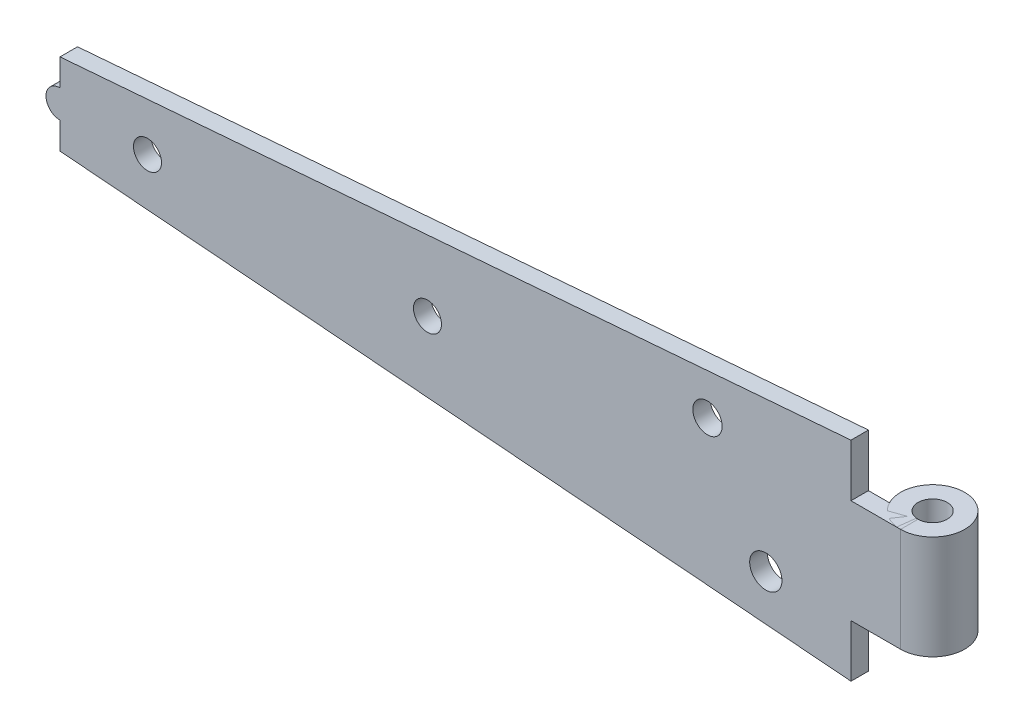
ISO-10303-21;
HEADER;
FILE_DESCRIPTION(('STEP AP214'),'2;1');
FILE_NAME('part.step','',(''),(''),'','','');
FILE_SCHEMA(('AUTOMOTIVE_DESIGN { 1 0 10303 214 1 1 1 1 }'));
ENDSEC;
DATA;
#1=APPLICATION_CONTEXT('core data for automotive mechanical design processes');
#2=APPLICATION_PROTOCOL_DEFINITION('international standard','automotive_design',2000,#1);
#3=PRODUCT_CONTEXT('',#1,'mechanical');
#4=PRODUCT('Part','Part','',(#3));
#5=PRODUCT_RELATED_PRODUCT_CATEGORY('part','',(#4));
#6=PRODUCT_DEFINITION_FORMATION('','',#4);
#7=PRODUCT_DEFINITION_CONTEXT('part definition',#1,'design');
#8=PRODUCT_DEFINITION('design','',#6,#7);
#9=PRODUCT_DEFINITION_SHAPE('','',#8);
#10=(LENGTH_UNIT() NAMED_UNIT(*) SI_UNIT(.MILLI.,.METRE.));
#11=(NAMED_UNIT(*) PLANE_ANGLE_UNIT() SI_UNIT($,.RADIAN.));
#12=(NAMED_UNIT(*) SI_UNIT($,.STERADIAN.) SOLID_ANGLE_UNIT());
#13=UNCERTAINTY_MEASURE_WITH_UNIT(LENGTH_MEASURE(1.E-05),#10,'distance_accuracy_value','');
#14=(GEOMETRIC_REPRESENTATION_CONTEXT(3) GLOBAL_UNCERTAINTY_ASSIGNED_CONTEXT((#13)) GLOBAL_UNIT_ASSIGNED_CONTEXT((#10,
#11,#12)) REPRESENTATION_CONTEXT('',''));
#15=CARTESIAN_POINT('',(0.,0.,0.));
#16=DIRECTION('',(0.,0.,1.));
#17=DIRECTION('',(1.,0.,0.));
#18=AXIS2_PLACEMENT_3D('',#15,#16,#17);
#19=CARTESIAN_POINT('',(8.49999999999998,26.8,-2.5));
#20=DIRECTION('',(0.,-1.,0.));
#21=DIRECTION('',(0.,0.,-1.));
#22=AXIS2_PLACEMENT_3D('',#19,#20,#21);
#23=CYLINDRICAL_SURFACE('',#22,5.5);
#24=CARTESIAN_POINT('',(8.49999999999998,26.8,-2.5));
#25=DIRECTION('',(0.,1.,0.));
#26=DIRECTION('',(0.,0.,1.));
#27=AXIS2_PLACEMENT_3D('',#24,#25,#26);
#28=CIRCLE('',#27,5.5);
#29=CARTESIAN_POINT('',(8.49999999999998,26.8,3.));
#30=VERTEX_POINT('',#29);
#31=EDGE_CURVE('E11',#30,#30,#28,.T.);
#32=ORIENTED_EDGE('',*,*,#31,.F.);
#33=EDGE_LOOP('',(#32));
#34=FACE_BOUND('',#33,.T.);
#35=CARTESIAN_POINT('',(8.49999999999998,9.,-2.5));
#36=DIRECTION('',(0.,1.,0.));
#37=DIRECTION('',(0.,0.,1.));
#38=AXIS2_PLACEMENT_3D('',#35,#36,#37);
#39=CIRCLE('',#38,5.5);
#40=CARTESIAN_POINT('',(8.49999999999998,9.,3.));
#41=VERTEX_POINT('',#40);
#42=EDGE_CURVE('E58',#41,#41,#39,.T.);
#43=ORIENTED_EDGE('',*,*,#42,.T.);
#44=EDGE_LOOP('',(#43));
#45=FACE_BOUND('',#44,.T.);
#46=ADVANCED_FACE('F52',(#34,#45),#23,.T.);
#47=CARTESIAN_POINT('',(8.49999999999998,26.8,-2.5));
#48=DIRECTION('',(0.,1.,0.));
#49=DIRECTION('',(0.,0.,1.));
#50=AXIS2_PLACEMENT_3D('',#47,#48,#49);
#51=PLANE('',#50);
#52=CARTESIAN_POINT('',(8.49999999999998,26.8,-2.5));
#53=DIRECTION('',(0.,1.,0.));
#54=DIRECTION('',(0.,0.,1.));
#55=AXIS2_PLACEMENT_3D('',#52,#53,#54);
#56=CIRCLE('',#55,2.5);
#57=CARTESIAN_POINT('',(8.49999999999998,26.8,0.));
#58=VERTEX_POINT('',#57);
#59=EDGE_CURVE('E63',#58,#58,#56,.F.);
#60=ORIENTED_EDGE('',*,*,#59,.T.);
#61=EDGE_LOOP('',(#60));
#62=FACE_BOUND('',#61,.T.);
#63=ORIENTED_EDGE('',*,*,#31,.T.);
#64=EDGE_LOOP('',(#63));
#65=FACE_BOUND('',#64,.T.);
#66=ADVANCED_FACE('F76',(#62,#65),#51,.T.);
#67=CARTESIAN_POINT('',(8.49999999999998,9.,-2.5));
#68=DIRECTION('',(0.,1.,0.));
#69=DIRECTION('',(0.,0.,1.));
#70=AXIS2_PLACEMENT_3D('',#67,#68,#69);
#71=PLANE('',#70);
#72=CARTESIAN_POINT('',(8.49999999999998,9.,-2.5));
#73=DIRECTION('',(0.,1.,0.));
#74=DIRECTION('',(0.,0.,1.));
#75=AXIS2_PLACEMENT_3D('',#72,#73,#74);
#76=CIRCLE('',#75,2.5);
#77=CARTESIAN_POINT('',(8.49999999999998,9.,0.));
#78=VERTEX_POINT('',#77);
#79=EDGE_CURVE('E57',#78,#78,#76,.F.);
#80=ORIENTED_EDGE('',*,*,#79,.F.);
#81=EDGE_LOOP('',(#80));
#82=FACE_BOUND('',#81,.T.);
#83=ORIENTED_EDGE('',*,*,#42,.F.);
#84=EDGE_LOOP('',(#83));
#85=FACE_BOUND('',#84,.T.);
#86=ADVANCED_FACE('F72',(#82,#85),#71,.F.);
#87=CARTESIAN_POINT('',(8.49999999999998,35.8,-2.5));
#88=DIRECTION('',(0.,-1.,0.));
#89=DIRECTION('',(0.,0.,-1.));
#90=AXIS2_PLACEMENT_3D('',#87,#88,#89);
#91=CYLINDRICAL_SURFACE('',#90,2.5);
#92=ORIENTED_EDGE('',*,*,#59,.F.);
#93=EDGE_LOOP('',(#92));
#94=FACE_BOUND('',#93,.T.);
#95=ORIENTED_EDGE('',*,*,#79,.T.);
#96=EDGE_LOOP('',(#95));
#97=FACE_BOUND('',#96,.T.);
#98=ADVANCED_FACE('F71',(#94,#97),#91,.F.);
#99=CLOSED_SHELL('',(#46,#66,#86,#98));
#100=MANIFOLD_SOLID_BREP('B2',#99);
#101=CARTESIAN_POINT('',(-135.6,17.9,3.));
#102=DIRECTION('',(0.,0.,1.));
#103=DIRECTION('',(1.,0.,0.));
#104=AXIS2_PLACEMENT_3D('',#101,#102,#103);
#105=PLANE('',#104);
#106=CARTESIAN_POINT('',(-24.6,26.8,3.));
#107=DIRECTION('',(0.,0.,1.));
#108=DIRECTION('',(1.,0.,0.));
#109=AXIS2_PLACEMENT_3D('',#106,#107,#108);
#110=CIRCLE('',#109,2.51500077392616);
#111=CARTESIAN_POINT('',(-22.0849992260738,26.8,3.));
#112=VERTEX_POINT('',#111);
#113=EDGE_CURVE('E331',#112,#112,#110,.T.);
#114=ORIENTED_EDGE('',*,*,#113,.F.);
#115=EDGE_LOOP('',(#114));
#116=FACE_BOUND('',#115,.T.);
#117=CARTESIAN_POINT('',(-120.6,17.9,3.));
#118=DIRECTION('',(0.,0.,1.));
#119=DIRECTION('',(1.,0.,0.));
#120=AXIS2_PLACEMENT_3D('',#117,#118,#119);
#121=CIRCLE('',#120,2.4);
#122=CARTESIAN_POINT('',(-118.2,17.9,3.));
#123=VERTEX_POINT('',#122);
#124=EDGE_CURVE('E234',#123,#123,#121,.T.);
#125=ORIENTED_EDGE('',*,*,#124,.F.);
#126=EDGE_LOOP('',(#125));
#127=FACE_BOUND('',#126,.T.);
#128=DIRECTION('',(0.,1.,0.));
#129=VECTOR('',#128,1.);
#130=CARTESIAN_POINT('',(0.,9.,3.));
#131=LINE('',#130,#129);
#132=CARTESIAN_POINT('',(0.,0.,3.));
#133=VERTEX_POINT('',#132);
#134=CARTESIAN_POINT('',(0.,9.,3.));
#135=VERTEX_POINT('',#134);
#136=EDGE_CURVE('E259',#133,#135,#131,.T.);
#137=ORIENTED_EDGE('',*,*,#136,.T.);
#138=DIRECTION('',(1.,0.,0.));
#139=VECTOR('',#138,1.);
#140=CARTESIAN_POINT('',(0.,9.,3.));
#141=LINE('',#140,#139);
#142=CARTESIAN_POINT('',(8.5,9.,3.));
#143=VERTEX_POINT('',#142);
#144=EDGE_CURVE('E185',#135,#143,#141,.T.);
#145=ORIENTED_EDGE('',*,*,#144,.T.);
#146=DIRECTION('',(0.,1.,0.));
#147=VECTOR('',#146,1.);
#148=CARTESIAN_POINT('',(8.5,26.8,3.));
#149=LINE('',#148,#147);
#150=CARTESIAN_POINT('',(8.5,26.8,3.));
#151=VERTEX_POINT('',#150);
#152=EDGE_CURVE('E290',#143,#151,#149,.T.);
#153=ORIENTED_EDGE('',*,*,#152,.T.);
#154=DIRECTION('',(-1.,0.,0.));
#155=VECTOR('',#154,1.);
#156=CARTESIAN_POINT('',(0.,26.8,3.));
#157=LINE('',#156,#155);
#158=CARTESIAN_POINT('',(0.,26.8,3.));
#159=VERTEX_POINT('',#158);
#160=EDGE_CURVE('E310',#151,#159,#157,.T.);
#161=ORIENTED_EDGE('',*,*,#160,.T.);
#162=DIRECTION('',(0.,1.,0.));
#163=VECTOR('',#162,1.);
#164=CARTESIAN_POINT('',(0.,35.8,3.));
#165=LINE('',#164,#163);
#166=CARTESIAN_POINT('',(0.,35.8,3.));
#167=VERTEX_POINT('',#166);
#168=EDGE_CURVE('E303',#159,#167,#165,.T.);
#169=ORIENTED_EDGE('',*,*,#168,.T.);
#170=DIRECTION('',(-0.996784820812194,-0.0801250335313637,0.));
#171=VECTOR('',#170,1.);
#172=CARTESIAN_POINT('',(-135.6,24.9,3.));
#173=LINE('',#172,#171);
#174=CARTESIAN_POINT('',(-135.6,24.9,3.));
#175=VERTEX_POINT('',#174);
#176=EDGE_CURVE('E306',#167,#175,#173,.T.);
#177=ORIENTED_EDGE('',*,*,#176,.T.);
#178=DIRECTION('',(0.,-1.,0.));
#179=VECTOR('',#178,1.);
#180=CARTESIAN_POINT('',(-135.6,20.3,3.));
#181=LINE('',#180,#179);
#182=CARTESIAN_POINT('',(-135.6,20.3,3.));
#183=VERTEX_POINT('',#182);
#184=EDGE_CURVE('E210',#175,#183,#181,.T.);
#185=ORIENTED_EDGE('',*,*,#184,.T.);
#186=CARTESIAN_POINT('',(-135.6,17.9,3.));
#187=DIRECTION('',(0.,0.,1.));
#188=DIRECTION('',(1.,0.,0.));
#189=AXIS2_PLACEMENT_3D('',#186,#187,#188);
#190=CIRCLE('',#189,2.4);
#191=CARTESIAN_POINT('',(-135.6,15.5,3.));
#192=VERTEX_POINT('',#191);
#193=EDGE_CURVE('E203',#183,#192,#190,.T.);
#194=ORIENTED_EDGE('',*,*,#193,.T.);
#195=DIRECTION('',(0.,-1.,0.));
#196=VECTOR('',#195,1.);
#197=CARTESIAN_POINT('',(-135.6,10.9,3.));
#198=LINE('',#197,#196);
#199=CARTESIAN_POINT('',(-135.6,10.9,3.));
#200=VERTEX_POINT('',#199);
#201=EDGE_CURVE('E202',#192,#200,#198,.T.);
#202=ORIENTED_EDGE('',*,*,#201,.T.);
#203=DIRECTION('',(0.996784820812194,-0.0801250335313636,0.));
#204=VECTOR('',#203,1.);
#205=CARTESIAN_POINT('',(0.,0.,3.));
#206=LINE('',#205,#204);
#207=EDGE_CURVE('E135',#200,#133,#206,.T.);
#208=ORIENTED_EDGE('',*,*,#207,.T.);
#209=EDGE_LOOP('',(#137,#145,#153,#161,#169,#177,#185,#194,#202,#208));
#210=FACE_BOUND('',#209,.T.);
#211=CARTESIAN_POINT('',(-72.6,17.9,3.));
#212=DIRECTION('',(0.,0.,1.));
#213=DIRECTION('',(1.,0.,0.));
#214=AXIS2_PLACEMENT_3D('',#211,#212,#213);
#215=CIRCLE('',#214,2.4);
#216=CARTESIAN_POINT('',(-70.2,17.9,3.));
#217=VERTEX_POINT('',#216);
#218=EDGE_CURVE('E323',#217,#217,#215,.T.);
#219=ORIENTED_EDGE('',*,*,#218,.F.);
#220=EDGE_LOOP('',(#219));
#221=FACE_BOUND('',#220,.T.);
#222=CARTESIAN_POINT('',(-14.6,9.,3.));
#223=DIRECTION('',(0.,0.,1.));
#224=DIRECTION('',(1.,0.,0.));
#225=AXIS2_PLACEMENT_3D('',#222,#223,#224);
#226=CIRCLE('',#225,2.7640023032655);
#227=CARTESIAN_POINT('',(-11.8359976967345,9.,3.));
#228=VERTEX_POINT('',#227);
#229=EDGE_CURVE('E342',#228,#228,#226,.T.);
#230=ORIENTED_EDGE('',*,*,#229,.F.);
#231=EDGE_LOOP('',(#230));
#232=FACE_BOUND('',#231,.T.);
#233=ADVANCED_FACE('F114',(#116,#127,#210,#221,#232),#105,.T.);
#234=CARTESIAN_POINT('',(-135.6,17.9,0.));
#235=DIRECTION('',(0.,0.,1.));
#236=DIRECTION('',(1.,0.,0.));
#237=AXIS2_PLACEMENT_3D('',#234,#235,#236);
#238=PLANE('',#237);
#239=DIRECTION('',(0.,1.,0.));
#240=VECTOR('',#239,1.);
#241=CARTESIAN_POINT('',(0.,9.,0.));
#242=LINE('',#241,#240);
#243=CARTESIAN_POINT('',(0.,0.,0.));
#244=VERTEX_POINT('',#243);
#245=CARTESIAN_POINT('',(0.,9.,0.));
#246=VERTEX_POINT('',#245);
#247=EDGE_CURVE('E230',#244,#246,#242,.T.);
#248=ORIENTED_EDGE('',*,*,#247,.F.);
#249=DIRECTION('',(0.996784820812194,-0.0801250335313636,0.));
#250=VECTOR('',#249,1.);
#251=CARTESIAN_POINT('',(0.,0.,0.));
#252=LINE('',#251,#250);
#253=CARTESIAN_POINT('',(-135.6,10.9,0.));
#254=VERTEX_POINT('',#253);
#255=EDGE_CURVE('E172',#254,#244,#252,.T.);
#256=ORIENTED_EDGE('',*,*,#255,.F.);
#257=DIRECTION('',(0.,-1.,0.));
#258=VECTOR('',#257,1.);
#259=CARTESIAN_POINT('',(-135.6,10.9,0.));
#260=LINE('',#259,#258);
#261=CARTESIAN_POINT('',(-135.6,15.5,0.));
#262=VERTEX_POINT('',#261);
#263=EDGE_CURVE('E166',#262,#254,#260,.T.);
#264=ORIENTED_EDGE('',*,*,#263,.F.);
#265=CARTESIAN_POINT('',(-135.6,17.9,0.));
#266=DIRECTION('',(0.,0.,1.));
#267=DIRECTION('',(1.,0.,0.));
#268=AXIS2_PLACEMENT_3D('',#265,#266,#267);
#269=CIRCLE('',#268,2.4);
#270=CARTESIAN_POINT('',(-135.6,20.3,0.));
#271=VERTEX_POINT('',#270);
#272=EDGE_CURVE('E217',#271,#262,#269,.T.);
#273=ORIENTED_EDGE('',*,*,#272,.F.);
#274=DIRECTION('',(0.,-1.,0.));
#275=VECTOR('',#274,1.);
#276=CARTESIAN_POINT('',(-135.6,20.3,0.));
#277=LINE('',#276,#275);
#278=CARTESIAN_POINT('',(-135.6,24.9,0.));
#279=VERTEX_POINT('',#278);
#280=EDGE_CURVE('E248',#279,#271,#277,.T.);
#281=ORIENTED_EDGE('',*,*,#280,.F.);
#282=DIRECTION('',(-0.996784820812194,-0.0801250335313637,0.));
#283=VECTOR('',#282,1.);
#284=CARTESIAN_POINT('',(-135.6,24.9,0.));
#285=LINE('',#284,#283);
#286=CARTESIAN_POINT('',(0.,35.8,0.));
#287=VERTEX_POINT('',#286);
#288=EDGE_CURVE('E246',#287,#279,#285,.T.);
#289=ORIENTED_EDGE('',*,*,#288,.F.);
#290=DIRECTION('',(0.,1.,0.));
#291=VECTOR('',#290,1.);
#292=CARTESIAN_POINT('',(0.,35.8,0.));
#293=LINE('',#292,#291);
#294=CARTESIAN_POINT('',(0.,26.8,0.));
#295=VERTEX_POINT('',#294);
#296=EDGE_CURVE('E243',#295,#287,#293,.T.);
#297=ORIENTED_EDGE('',*,*,#296,.F.);
#298=DIRECTION('',(-1.,0.,0.));
#299=VECTOR('',#298,1.);
#300=CARTESIAN_POINT('',(0.,26.8,0.));
#301=LINE('',#300,#299);
#302=CARTESIAN_POINT('',(8.5,26.8,0.));
#303=VERTEX_POINT('',#302);
#304=EDGE_CURVE('E239',#303,#295,#301,.T.);
#305=ORIENTED_EDGE('',*,*,#304,.F.);
#306=DIRECTION('',(0.,1.,0.));
#307=VECTOR('',#306,1.);
#308=CARTESIAN_POINT('',(8.5,26.8,0.));
#309=LINE('',#308,#307);
#310=CARTESIAN_POINT('',(8.5,9.,0.));
#311=VERTEX_POINT('',#310);
#312=EDGE_CURVE('E240',#311,#303,#309,.T.);
#313=ORIENTED_EDGE('',*,*,#312,.F.);
#314=DIRECTION('',(1.,0.,0.));
#315=VECTOR('',#314,1.);
#316=CARTESIAN_POINT('',(0.,9.,0.));
#317=LINE('',#316,#315);
#318=EDGE_CURVE('E231',#246,#311,#317,.T.);
#319=ORIENTED_EDGE('',*,*,#318,.F.);
#320=EDGE_LOOP('',(#248,#256,#264,#273,#281,#289,#297,#305,#313,#319));
#321=FACE_BOUND('',#320,.T.);
#322=CARTESIAN_POINT('',(-120.6,17.9,0.));
#323=DIRECTION('',(0.,0.,1.));
#324=DIRECTION('',(1.,0.,0.));
#325=AXIS2_PLACEMENT_3D('',#322,#323,#324);
#326=CIRCLE('',#325,2.4);
#327=CARTESIAN_POINT('',(-118.2,17.9,0.));
#328=VERTEX_POINT('',#327);
#329=EDGE_CURVE('E322',#328,#328,#326,.T.);
#330=ORIENTED_EDGE('',*,*,#329,.T.);
#331=EDGE_LOOP('',(#330));
#332=FACE_BOUND('',#331,.T.);
#333=CARTESIAN_POINT('',(-72.6,17.9,0.));
#334=DIRECTION('',(0.,0.,1.));
#335=DIRECTION('',(1.,0.,0.));
#336=AXIS2_PLACEMENT_3D('',#333,#334,#335);
#337=CIRCLE('',#336,2.4);
#338=CARTESIAN_POINT('',(-70.2,17.9,0.));
#339=VERTEX_POINT('',#338);
#340=EDGE_CURVE('E326',#339,#339,#337,.T.);
#341=ORIENTED_EDGE('',*,*,#340,.T.);
#342=EDGE_LOOP('',(#341));
#343=FACE_BOUND('',#342,.T.);
#344=CARTESIAN_POINT('',(-24.6,26.8,0.));
#345=DIRECTION('',(0.,0.,1.));
#346=DIRECTION('',(1.,0.,0.));
#347=AXIS2_PLACEMENT_3D('',#344,#345,#346);
#348=CIRCLE('',#347,2.51500077392616);
#349=CARTESIAN_POINT('',(-22.0849992260738,26.8,0.));
#350=VERTEX_POINT('',#349);
#351=EDGE_CURVE('E340',#350,#350,#348,.T.);
#352=ORIENTED_EDGE('',*,*,#351,.T.);
#353=EDGE_LOOP('',(#352));
#354=FACE_BOUND('',#353,.T.);
#355=CARTESIAN_POINT('',(-14.6,9.,0.));
#356=DIRECTION('',(0.,0.,1.));
#357=DIRECTION('',(1.,0.,0.));
#358=AXIS2_PLACEMENT_3D('',#355,#356,#357);
#359=CIRCLE('',#358,2.7640023032655);
#360=CARTESIAN_POINT('',(-11.8359976967345,9.,0.));
#361=VERTEX_POINT('',#360);
#362=EDGE_CURVE('E343',#361,#361,#359,.T.);
#363=ORIENTED_EDGE('',*,*,#362,.T.);
#364=EDGE_LOOP('',(#363));
#365=FACE_BOUND('',#364,.T.);
#366=ADVANCED_FACE('F293',(#321,#332,#343,#354,#365),#238,.F.);
#367=CARTESIAN_POINT('',(0.,9.,3.));
#368=DIRECTION('',(-1.,0.,0.));
#369=DIRECTION('',(0.,-1.,0.));
#370=AXIS2_PLACEMENT_3D('',#367,#368,#369);
#371=PLANE('',#370);
#372=ORIENTED_EDGE('',*,*,#247,.T.);
#373=DIRECTION('',(0.,0.,-1.));
#374=VECTOR('',#373,1.);
#375=CARTESIAN_POINT('',(0.,9.,3.));
#376=LINE('',#375,#374);
#377=EDGE_CURVE('E51',#135,#246,#376,.T.);
#378=ORIENTED_EDGE('',*,*,#377,.F.);
#379=ORIENTED_EDGE('',*,*,#136,.F.);
#380=DIRECTION('',(0.,0.,-1.));
#381=VECTOR('',#380,1.);
#382=CARTESIAN_POINT('',(0.,0.,3.));
#383=LINE('',#382,#381);
#384=EDGE_CURVE('E222',#133,#244,#383,.T.);
#385=ORIENTED_EDGE('',*,*,#384,.T.);
#386=EDGE_LOOP('',(#372,#378,#379,#385));
#387=FACE_BOUND('',#386,.T.);
#388=ADVANCED_FACE('F120',(#387),#371,.F.);
#389=CARTESIAN_POINT('',(0.,9.,3.));
#390=DIRECTION('',(0.,1.,0.));
#391=DIRECTION('',(0.,0.,1.));
#392=AXIS2_PLACEMENT_3D('',#389,#390,#391);
#393=PLANE('',#392);
#394=ORIENTED_EDGE('',*,*,#318,.T.);
#395=DIRECTION('',(0.,0.,-1.));
#396=VECTOR('',#395,1.);
#397=CARTESIAN_POINT('',(8.5,9.,3.));
#398=LINE('',#397,#396);
#399=EDGE_CURVE('E123',#143,#311,#398,.T.);
#400=ORIENTED_EDGE('',*,*,#399,.F.);
#401=ORIENTED_EDGE('',*,*,#144,.F.);
#402=ORIENTED_EDGE('',*,*,#377,.T.);
#403=EDGE_LOOP('',(#394,#400,#401,#402));
#404=FACE_BOUND('',#403,.T.);
#405=ADVANCED_FACE('F386',(#404),#393,.F.);
#406=CARTESIAN_POINT('',(8.5,26.8,3.));
#407=DIRECTION('',(-1.,0.,0.));
#408=DIRECTION('',(0.,-1.,0.));
#409=AXIS2_PLACEMENT_3D('',#406,#407,#408);
#410=PLANE('',#409);
#411=ORIENTED_EDGE('',*,*,#312,.T.);
#412=DIRECTION('',(0.,0.,-1.));
#413=VECTOR('',#412,1.);
#414=CARTESIAN_POINT('',(8.5,26.8,3.));
#415=LINE('',#414,#413);
#416=EDGE_CURVE('E280',#151,#303,#415,.T.);
#417=ORIENTED_EDGE('',*,*,#416,.F.);
#418=ORIENTED_EDGE('',*,*,#152,.F.);
#419=ORIENTED_EDGE('',*,*,#399,.T.);
#420=EDGE_LOOP('',(#411,#417,#418,#419));
#421=FACE_BOUND('',#420,.T.);
#422=ADVANCED_FACE('F283',(#421),#410,.F.);
#423=CARTESIAN_POINT('',(0.,26.8,3.));
#424=DIRECTION('',(0.,-1.,0.));
#425=DIRECTION('',(0.,0.,-1.));
#426=AXIS2_PLACEMENT_3D('',#423,#424,#425);
#427=PLANE('',#426);
#428=ORIENTED_EDGE('',*,*,#304,.T.);
#429=DIRECTION('',(0.,0.,-1.));
#430=VECTOR('',#429,1.);
#431=CARTESIAN_POINT('',(0.,26.8,3.));
#432=LINE('',#431,#430);
#433=EDGE_CURVE('E271',#159,#295,#432,.T.);
#434=ORIENTED_EDGE('',*,*,#433,.F.);
#435=ORIENTED_EDGE('',*,*,#160,.F.);
#436=ORIENTED_EDGE('',*,*,#416,.T.);
#437=EDGE_LOOP('',(#428,#434,#435,#436));
#438=FACE_BOUND('',#437,.T.);
#439=ADVANCED_FACE('F300',(#438),#427,.F.);
#440=CARTESIAN_POINT('',(0.,35.8,3.));
#441=DIRECTION('',(-1.,0.,0.));
#442=DIRECTION('',(0.,-1.,0.));
#443=AXIS2_PLACEMENT_3D('',#440,#441,#442);
#444=PLANE('',#443);
#445=ORIENTED_EDGE('',*,*,#296,.T.);
#446=DIRECTION('',(0.,0.,-1.));
#447=VECTOR('',#446,1.);
#448=CARTESIAN_POINT('',(0.,35.8,3.));
#449=LINE('',#448,#447);
#450=EDGE_CURVE('E269',#167,#287,#449,.T.);
#451=ORIENTED_EDGE('',*,*,#450,.F.);
#452=ORIENTED_EDGE('',*,*,#168,.F.);
#453=ORIENTED_EDGE('',*,*,#433,.T.);
#454=EDGE_LOOP('',(#445,#451,#452,#453));
#455=FACE_BOUND('',#454,.T.);
#456=ADVANCED_FACE('F301',(#455),#444,.F.);
#457=CARTESIAN_POINT('',(-135.6,24.9,3.));
#458=DIRECTION('',(0.0801250335313637,-0.996784820812194,0.));
#459=DIRECTION('',(0.996784820812194,0.0801250335313637,0.));
#460=AXIS2_PLACEMENT_3D('',#457,#458,#459);
#461=PLANE('',#460);
#462=ORIENTED_EDGE('',*,*,#288,.T.);
#463=DIRECTION('',(0.,0.,-1.));
#464=VECTOR('',#463,1.);
#465=CARTESIAN_POINT('',(-135.6,24.9,3.));
#466=LINE('',#465,#464);
#467=EDGE_CURVE('E263',#175,#279,#466,.T.);
#468=ORIENTED_EDGE('',*,*,#467,.F.);
#469=ORIENTED_EDGE('',*,*,#176,.F.);
#470=ORIENTED_EDGE('',*,*,#450,.T.);
#471=EDGE_LOOP('',(#462,#468,#469,#470));
#472=FACE_BOUND('',#471,.T.);
#473=ADVANCED_FACE('F378',(#472),#461,.F.);
#474=CARTESIAN_POINT('',(-135.6,20.3,3.));
#475=DIRECTION('',(1.,0.,0.));
#476=DIRECTION('',(0.,1.,0.));
#477=AXIS2_PLACEMENT_3D('',#474,#475,#476);
#478=PLANE('',#477);
#479=ORIENTED_EDGE('',*,*,#280,.T.);
#480=DIRECTION('',(0.,0.,-1.));
#481=VECTOR('',#480,1.);
#482=CARTESIAN_POINT('',(-135.6,20.3,3.));
#483=LINE('',#482,#481);
#484=EDGE_CURVE('E220',#183,#271,#483,.T.);
#485=ORIENTED_EDGE('',*,*,#484,.F.);
#486=ORIENTED_EDGE('',*,*,#184,.F.);
#487=ORIENTED_EDGE('',*,*,#467,.T.);
#488=EDGE_LOOP('',(#479,#485,#486,#487));
#489=FACE_BOUND('',#488,.T.);
#490=ADVANCED_FACE('F376',(#489),#478,.F.);
#491=CARTESIAN_POINT('',(-135.6,17.9,3.));
#492=DIRECTION('',(0.,0.,-1.));
#493=DIRECTION('',(-1.,0.,0.));
#494=AXIS2_PLACEMENT_3D('',#491,#492,#493);
#495=CYLINDRICAL_SURFACE('',#494,2.4);
#496=ORIENTED_EDGE('',*,*,#272,.T.);
#497=DIRECTION('',(0.,0.,-1.));
#498=VECTOR('',#497,1.);
#499=CARTESIAN_POINT('',(-135.6,15.5,3.));
#500=LINE('',#499,#498);
#501=EDGE_CURVE('E214',#192,#262,#500,.T.);
#502=ORIENTED_EDGE('',*,*,#501,.F.);
#503=ORIENTED_EDGE('',*,*,#193,.F.);
#504=ORIENTED_EDGE('',*,*,#484,.T.);
#505=EDGE_LOOP('',(#496,#502,#503,#504));
#506=FACE_BOUND('',#505,.T.);
#507=ADVANCED_FACE('F211',(#506),#495,.T.);
#508=CARTESIAN_POINT('',(-135.6,10.9,3.));
#509=DIRECTION('',(1.,0.,0.));
#510=DIRECTION('',(0.,1.,0.));
#511=AXIS2_PLACEMENT_3D('',#508,#509,#510);
#512=PLANE('',#511);
#513=ORIENTED_EDGE('',*,*,#263,.T.);
#514=DIRECTION('',(0.,0.,-1.));
#515=VECTOR('',#514,1.);
#516=CARTESIAN_POINT('',(-135.6,10.9,3.));
#517=LINE('',#516,#515);
#518=EDGE_CURVE('E216',#200,#254,#517,.T.);
#519=ORIENTED_EDGE('',*,*,#518,.F.);
#520=ORIENTED_EDGE('',*,*,#201,.F.);
#521=ORIENTED_EDGE('',*,*,#501,.T.);
#522=EDGE_LOOP('',(#513,#519,#520,#521));
#523=FACE_BOUND('',#522,.T.);
#524=ADVANCED_FACE('F223',(#523),#512,.F.);
#525=CARTESIAN_POINT('',(0.,0.,3.));
#526=DIRECTION('',(0.0801250335313636,0.996784820812194,0.));
#527=DIRECTION('',(-0.996784820812194,0.0801250335313636,0.));
#528=AXIS2_PLACEMENT_3D('',#525,#526,#527);
#529=PLANE('',#528);
#530=ORIENTED_EDGE('',*,*,#255,.T.);
#531=ORIENTED_EDGE('',*,*,#384,.F.);
#532=ORIENTED_EDGE('',*,*,#207,.F.);
#533=ORIENTED_EDGE('',*,*,#518,.T.);
#534=EDGE_LOOP('',(#530,#531,#532,#533));
#535=FACE_BOUND('',#534,.T.);
#536=ADVANCED_FACE('F367',(#535),#529,.F.);
#537=CARTESIAN_POINT('',(-120.6,17.9,3.));
#538=DIRECTION('',(0.,0.,-1.));
#539=DIRECTION('',(-1.,0.,0.));
#540=AXIS2_PLACEMENT_3D('',#537,#538,#539);
#541=CYLINDRICAL_SURFACE('',#540,2.4);
#542=ORIENTED_EDGE('',*,*,#124,.T.);
#543=EDGE_LOOP('',(#542));
#544=FACE_BOUND('',#543,.T.);
#545=ORIENTED_EDGE('',*,*,#329,.F.);
#546=EDGE_LOOP('',(#545));
#547=FACE_BOUND('',#546,.T.);
#548=ADVANCED_FACE('F366',(#544,#547),#541,.F.);
#549=CARTESIAN_POINT('',(-72.6,17.9,3.));
#550=DIRECTION('',(0.,0.,-1.));
#551=DIRECTION('',(-1.,0.,0.));
#552=AXIS2_PLACEMENT_3D('',#549,#550,#551);
#553=CYLINDRICAL_SURFACE('',#552,2.4);
#554=ORIENTED_EDGE('',*,*,#218,.T.);
#555=EDGE_LOOP('',(#554));
#556=FACE_BOUND('',#555,.T.);
#557=ORIENTED_EDGE('',*,*,#340,.F.);
#558=EDGE_LOOP('',(#557));
#559=FACE_BOUND('',#558,.T.);
#560=ADVANCED_FACE('F464',(#556,#559),#553,.F.);
#561=CARTESIAN_POINT('',(-24.6,26.8,3.));
#562=DIRECTION('',(0.,0.,-1.));
#563=DIRECTION('',(-1.,0.,0.));
#564=AXIS2_PLACEMENT_3D('',#561,#562,#563);
#565=CYLINDRICAL_SURFACE('',#564,2.51500077392616);
#566=ORIENTED_EDGE('',*,*,#113,.T.);
#567=EDGE_LOOP('',(#566));
#568=FACE_BOUND('',#567,.T.);
#569=ORIENTED_EDGE('',*,*,#351,.F.);
#570=EDGE_LOOP('',(#569));
#571=FACE_BOUND('',#570,.T.);
#572=ADVANCED_FACE('F475',(#568,#571),#565,.F.);
#573=CARTESIAN_POINT('',(-14.6,9.,3.));
#574=DIRECTION('',(0.,0.,-1.));
#575=DIRECTION('',(-1.,0.,0.));
#576=AXIS2_PLACEMENT_3D('',#573,#574,#575);
#577=CYLINDRICAL_SURFACE('',#576,2.7640023032655);
#578=ORIENTED_EDGE('',*,*,#229,.T.);
#579=EDGE_LOOP('',(#578));
#580=FACE_BOUND('',#579,.T.);
#581=ORIENTED_EDGE('',*,*,#362,.F.);
#582=EDGE_LOOP('',(#581));
#583=FACE_BOUND('',#582,.T.);
#584=ADVANCED_FACE('F351',(#580,#583),#577,.F.);
#585=CLOSED_SHELL('',(#233,#366,#388,#405,#422,#439,#456,#473,#490,#507,#524,#536,#548,#560,
#572,#584));
#586=MANIFOLD_SOLID_BREP('B6',#585);
#587=ADVANCED_BREP_SHAPE_REPRESENTATION('',(#18,#100,#586),#14);
#588=SHAPE_DEFINITION_REPRESENTATION(#9,#587);
ENDSEC;
END-ISO-10303-21;
